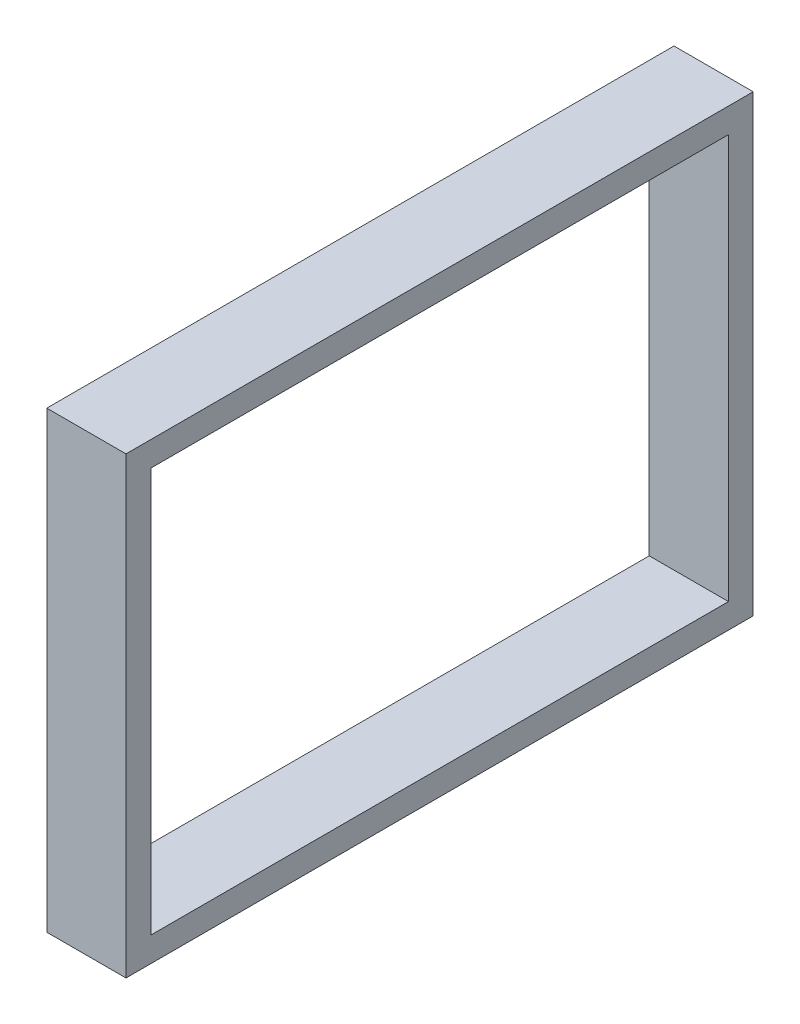
ISO-10303-21;
HEADER;
FILE_DESCRIPTION(('STEP AP214'),'2;1');
FILE_NAME('part.step','',(''),(''),'','','');
FILE_SCHEMA(('AUTOMOTIVE_DESIGN { 1 0 10303 214 1 1 1 1 }'));
ENDSEC;
DATA;
#1=APPLICATION_CONTEXT('core data for automotive mechanical design processes');
#2=APPLICATION_PROTOCOL_DEFINITION('international standard','automotive_design',2000,#1);
#3=PRODUCT_CONTEXT('',#1,'mechanical');
#4=PRODUCT('Part','Part','',(#3));
#5=PRODUCT_RELATED_PRODUCT_CATEGORY('part','',(#4));
#6=PRODUCT_DEFINITION_FORMATION('','',#4);
#7=PRODUCT_DEFINITION_CONTEXT('part definition',#1,'design');
#8=PRODUCT_DEFINITION('design','',#6,#7);
#9=PRODUCT_DEFINITION_SHAPE('','',#8);
#10=(LENGTH_UNIT() NAMED_UNIT(*) SI_UNIT(.MILLI.,.METRE.));
#11=(NAMED_UNIT(*) PLANE_ANGLE_UNIT() SI_UNIT($,.RADIAN.));
#12=(NAMED_UNIT(*) SI_UNIT($,.STERADIAN.) SOLID_ANGLE_UNIT());
#13=UNCERTAINTY_MEASURE_WITH_UNIT(LENGTH_MEASURE(1.E-05),#10,'distance_accuracy_value','');
#14=(GEOMETRIC_REPRESENTATION_CONTEXT(3) GLOBAL_UNCERTAINTY_ASSIGNED_CONTEXT((#13)) GLOBAL_UNIT_ASSIGNED_CONTEXT((#10,
#11,#12)) REPRESENTATION_CONTEXT('',''));
#15=CARTESIAN_POINT('',(0.,0.,0.));
#16=DIRECTION('',(0.,0.,1.));
#17=DIRECTION('',(1.,0.,0.));
#18=AXIS2_PLACEMENT_3D('',#15,#16,#17);
#19=CARTESIAN_POINT('',(2.4,0.,0.));
#20=DIRECTION('',(-1.,0.,0.));
#21=DIRECTION('',(0.,0.,1.));
#22=AXIS2_PLACEMENT_3D('',#19,#20,#21);
#23=PLANE('',#22);
#24=DIRECTION('',(0.,1.,0.));
#25=VECTOR('',#24,1.);
#26=CARTESIAN_POINT('',(2.4,13.75,-6.5));
#27=LINE('',#26,#25);
#28=CARTESIAN_POINT('',(2.4,-13.75,-6.5));
#29=VERTEX_POINT('',#28);
#30=CARTESIAN_POINT('',(2.4,13.75,-6.5));
#31=VERTEX_POINT('',#30);
#32=EDGE_CURVE('E140',#29,#31,#27,.T.);
#33=ORIENTED_EDGE('',*,*,#32,.T.);
#34=DIRECTION('',(0.,0.,1.));
#35=VECTOR('',#34,1.);
#36=CARTESIAN_POINT('',(2.4,13.75,31.5));
#37=LINE('',#36,#35);
#38=CARTESIAN_POINT('',(2.4,13.75,31.5));
#39=VERTEX_POINT('',#38);
#40=EDGE_CURVE('E143',#31,#39,#37,.T.);
#41=ORIENTED_EDGE('',*,*,#40,.T.);
#42=DIRECTION('',(0.,-1.,0.));
#43=VECTOR('',#42,1.);
#44=CARTESIAN_POINT('',(2.4,-13.75,31.5));
#45=LINE('',#44,#43);
#46=CARTESIAN_POINT('',(2.4,-13.75,31.5));
#47=VERTEX_POINT('',#46);
#48=EDGE_CURVE('E146',#39,#47,#45,.T.);
#49=ORIENTED_EDGE('',*,*,#48,.T.);
#50=DIRECTION('',(0.,0.,-1.));
#51=VECTOR('',#50,1.);
#52=CARTESIAN_POINT('',(2.4,-13.75,-6.5));
#53=LINE('',#52,#51);
#54=EDGE_CURVE('E148',#47,#29,#53,.T.);
#55=ORIENTED_EDGE('',*,*,#54,.T.);
#56=EDGE_LOOP('',(#33,#41,#49,#55));
#57=FACE_BOUND('',#56,.T.);
#58=DIRECTION('',(0.,1.,0.));
#59=VECTOR('',#58,1.);
#60=CARTESIAN_POINT('',(2.4,12.25,-5.));
#61=LINE('',#60,#59);
#62=CARTESIAN_POINT('',(2.4,-12.25,-5.));
#63=VERTEX_POINT('',#62);
#64=CARTESIAN_POINT('',(2.4,12.25,-5.));
#65=VERTEX_POINT('',#64);
#66=EDGE_CURVE('E104',#63,#65,#61,.T.);
#67=ORIENTED_EDGE('',*,*,#66,.F.);
#68=DIRECTION('',(0.,0.,-1.));
#69=VECTOR('',#68,1.);
#70=CARTESIAN_POINT('',(2.4,-12.25,-5.));
#71=LINE('',#70,#69);
#72=CARTESIAN_POINT('',(2.4,-12.25,30.));
#73=VERTEX_POINT('',#72);
#74=EDGE_CURVE('E126',#73,#63,#71,.T.);
#75=ORIENTED_EDGE('',*,*,#74,.F.);
#76=DIRECTION('',(0.,-1.,0.));
#77=VECTOR('',#76,1.);
#78=CARTESIAN_POINT('',(2.4,-12.25,30.));
#79=LINE('',#78,#77);
#80=CARTESIAN_POINT('',(2.4,12.25,30.));
#81=VERTEX_POINT('',#80);
#82=EDGE_CURVE('E124',#81,#73,#79,.T.);
#83=ORIENTED_EDGE('',*,*,#82,.F.);
#84=DIRECTION('',(0.,0.,1.));
#85=VECTOR('',#84,1.);
#86=CARTESIAN_POINT('',(2.4,12.25,30.));
#87=LINE('',#86,#85);
#88=EDGE_CURVE('E112',#65,#81,#87,.T.);
#89=ORIENTED_EDGE('',*,*,#88,.F.);
#90=EDGE_LOOP('',(#67,#75,#83,#89));
#91=FACE_BOUND('',#90,.T.);
#92=ADVANCED_FACE('F39',(#57,#91),#23,.F.);
#93=CARTESIAN_POINT('',(-2.4,0.,0.));
#94=DIRECTION('',(-1.,0.,0.));
#95=DIRECTION('',(0.,0.,1.));
#96=AXIS2_PLACEMENT_3D('',#93,#94,#95);
#97=PLANE('',#96);
#98=DIRECTION('',(0.,1.,0.));
#99=VECTOR('',#98,1.);
#100=CARTESIAN_POINT('',(-2.4,13.75,-6.5));
#101=LINE('',#100,#99);
#102=CARTESIAN_POINT('',(-2.4,-13.75,-6.5));
#103=VERTEX_POINT('',#102);
#104=CARTESIAN_POINT('',(-2.4,13.75,-6.5));
#105=VERTEX_POINT('',#104);
#106=EDGE_CURVE('E120',#103,#105,#101,.T.);
#107=ORIENTED_EDGE('',*,*,#106,.F.);
#108=DIRECTION('',(0.,0.,-1.));
#109=VECTOR('',#108,1.);
#110=CARTESIAN_POINT('',(-2.4,-13.75,-6.5));
#111=LINE('',#110,#109);
#112=CARTESIAN_POINT('',(-2.4,-13.75,31.5));
#113=VERTEX_POINT('',#112);
#114=EDGE_CURVE('E144',#113,#103,#111,.T.);
#115=ORIENTED_EDGE('',*,*,#114,.F.);
#116=DIRECTION('',(0.,-1.,0.));
#117=VECTOR('',#116,1.);
#118=CARTESIAN_POINT('',(-2.4,-13.75,31.5));
#119=LINE('',#118,#117);
#120=CARTESIAN_POINT('',(-2.4,13.75,31.5));
#121=VERTEX_POINT('',#120);
#122=EDGE_CURVE('E155',#121,#113,#119,.T.);
#123=ORIENTED_EDGE('',*,*,#122,.F.);
#124=DIRECTION('',(0.,0.,1.));
#125=VECTOR('',#124,1.);
#126=CARTESIAN_POINT('',(-2.4,13.75,31.5));
#127=LINE('',#126,#125);
#128=EDGE_CURVE('E153',#105,#121,#127,.T.);
#129=ORIENTED_EDGE('',*,*,#128,.F.);
#130=EDGE_LOOP('',(#107,#115,#123,#129));
#131=FACE_BOUND('',#130,.T.);
#132=DIRECTION('',(0.,0.,-1.));
#133=VECTOR('',#132,1.);
#134=CARTESIAN_POINT('',(-2.4,-12.25,-5.));
#135=LINE('',#134,#133);
#136=CARTESIAN_POINT('',(-2.4,-12.25,30.));
#137=VERTEX_POINT('',#136);
#138=CARTESIAN_POINT('',(-2.4,-12.25,-5.));
#139=VERTEX_POINT('',#138);
#140=EDGE_CURVE('E113',#137,#139,#135,.T.);
#141=ORIENTED_EDGE('',*,*,#140,.T.);
#142=DIRECTION('',(0.,1.,0.));
#143=VECTOR('',#142,1.);
#144=CARTESIAN_POINT('',(-2.4,12.25,-5.));
#145=LINE('',#144,#143);
#146=CARTESIAN_POINT('',(-2.4,12.25,-5.));
#147=VERTEX_POINT('',#146);
#148=EDGE_CURVE('E62',#139,#147,#145,.T.);
#149=ORIENTED_EDGE('',*,*,#148,.T.);
#150=DIRECTION('',(0.,0.,1.));
#151=VECTOR('',#150,1.);
#152=CARTESIAN_POINT('',(-2.4,12.25,30.));
#153=LINE('',#152,#151);
#154=CARTESIAN_POINT('',(-2.4,12.25,30.));
#155=VERTEX_POINT('',#154);
#156=EDGE_CURVE('E119',#147,#155,#153,.T.);
#157=ORIENTED_EDGE('',*,*,#156,.T.);
#158=DIRECTION('',(0.,-1.,0.));
#159=VECTOR('',#158,1.);
#160=CARTESIAN_POINT('',(-2.4,-12.25,30.));
#161=LINE('',#160,#159);
#162=EDGE_CURVE('E132',#155,#137,#161,.T.);
#163=ORIENTED_EDGE('',*,*,#162,.T.);
#164=EDGE_LOOP('',(#141,#149,#157,#163));
#165=FACE_BOUND('',#164,.T.);
#166=ADVANCED_FACE('F173',(#131,#165),#97,.T.);
#167=CARTESIAN_POINT('',(2.4,13.75,-6.5));
#168=DIRECTION('',(0.,0.,1.));
#169=DIRECTION('',(1.,0.,0.));
#170=AXIS2_PLACEMENT_3D('',#167,#168,#169);
#171=PLANE('',#170);
#172=ORIENTED_EDGE('',*,*,#106,.T.);
#173=DIRECTION('',(-1.,0.,0.));
#174=VECTOR('',#173,1.);
#175=CARTESIAN_POINT('',(2.4,13.75,-6.5));
#176=LINE('',#175,#174);
#177=EDGE_CURVE('E11',#31,#105,#176,.T.);
#178=ORIENTED_EDGE('',*,*,#177,.F.);
#179=ORIENTED_EDGE('',*,*,#32,.F.);
#180=DIRECTION('',(-1.,0.,0.));
#181=VECTOR('',#180,1.);
#182=CARTESIAN_POINT('',(2.4,-13.75,-6.5));
#183=LINE('',#182,#181);
#184=EDGE_CURVE('E150',#29,#103,#183,.T.);
#185=ORIENTED_EDGE('',*,*,#184,.T.);
#186=EDGE_LOOP('',(#172,#178,#179,#185));
#187=FACE_BOUND('',#186,.T.);
#188=ADVANCED_FACE('F41',(#187),#171,.F.);
#189=CARTESIAN_POINT('',(2.4,13.75,31.5));
#190=DIRECTION('',(0.,-1.,0.));
#191=DIRECTION('',(0.,0.,-1.));
#192=AXIS2_PLACEMENT_3D('',#189,#190,#191);
#193=PLANE('',#192);
#194=ORIENTED_EDGE('',*,*,#128,.T.);
#195=DIRECTION('',(-1.,0.,0.));
#196=VECTOR('',#195,1.);
#197=CARTESIAN_POINT('',(2.4,13.75,31.5));
#198=LINE('',#197,#196);
#199=EDGE_CURVE('E47',#39,#121,#198,.T.);
#200=ORIENTED_EDGE('',*,*,#199,.F.);
#201=ORIENTED_EDGE('',*,*,#40,.F.);
#202=ORIENTED_EDGE('',*,*,#177,.T.);
#203=EDGE_LOOP('',(#194,#200,#201,#202));
#204=FACE_BOUND('',#203,.T.);
#205=ADVANCED_FACE('F183',(#204),#193,.F.);
#206=CARTESIAN_POINT('',(2.4,-13.75,31.5));
#207=DIRECTION('',(0.,0.,-1.));
#208=DIRECTION('',(-1.,0.,0.));
#209=AXIS2_PLACEMENT_3D('',#206,#207,#208);
#210=PLANE('',#209);
#211=ORIENTED_EDGE('',*,*,#122,.T.);
#212=DIRECTION('',(-1.,0.,0.));
#213=VECTOR('',#212,1.);
#214=CARTESIAN_POINT('',(2.4,-13.75,31.5));
#215=LINE('',#214,#213);
#216=EDGE_CURVE('E160',#47,#113,#215,.T.);
#217=ORIENTED_EDGE('',*,*,#216,.F.);
#218=ORIENTED_EDGE('',*,*,#48,.F.);
#219=ORIENTED_EDGE('',*,*,#199,.T.);
#220=EDGE_LOOP('',(#211,#217,#218,#219));
#221=FACE_BOUND('',#220,.T.);
#222=ADVANCED_FACE('F167',(#221),#210,.F.);
#223=CARTESIAN_POINT('',(2.4,-13.75,-6.5));
#224=DIRECTION('',(0.,1.,0.));
#225=DIRECTION('',(0.,0.,1.));
#226=AXIS2_PLACEMENT_3D('',#223,#224,#225);
#227=PLANE('',#226);
#228=ORIENTED_EDGE('',*,*,#114,.T.);
#229=ORIENTED_EDGE('',*,*,#184,.F.);
#230=ORIENTED_EDGE('',*,*,#54,.F.);
#231=ORIENTED_EDGE('',*,*,#216,.T.);
#232=EDGE_LOOP('',(#228,#229,#230,#231));
#233=FACE_BOUND('',#232,.T.);
#234=ADVANCED_FACE('F177',(#233),#227,.F.);
#235=CARTESIAN_POINT('',(2.4,12.25,-5.));
#236=DIRECTION('',(0.,0.,1.));
#237=DIRECTION('',(1.,0.,0.));
#238=AXIS2_PLACEMENT_3D('',#235,#236,#237);
#239=PLANE('',#238);
#240=ORIENTED_EDGE('',*,*,#148,.F.);
#241=DIRECTION('',(-1.,0.,0.));
#242=VECTOR('',#241,1.);
#243=CARTESIAN_POINT('',(2.4,-12.25,-5.));
#244=LINE('',#243,#242);
#245=EDGE_CURVE('E108',#63,#139,#244,.T.);
#246=ORIENTED_EDGE('',*,*,#245,.F.);
#247=ORIENTED_EDGE('',*,*,#66,.T.);
#248=DIRECTION('',(-1.,0.,0.));
#249=VECTOR('',#248,1.);
#250=CARTESIAN_POINT('',(2.4,12.25,-5.));
#251=LINE('',#250,#249);
#252=EDGE_CURVE('E107',#65,#147,#251,.T.);
#253=ORIENTED_EDGE('',*,*,#252,.T.);
#254=EDGE_LOOP('',(#240,#246,#247,#253));
#255=FACE_BOUND('',#254,.T.);
#256=ADVANCED_FACE('F106',(#255),#239,.T.);
#257=CARTESIAN_POINT('',(2.4,12.25,30.));
#258=DIRECTION('',(0.,-1.,0.));
#259=DIRECTION('',(0.,0.,-1.));
#260=AXIS2_PLACEMENT_3D('',#257,#258,#259);
#261=PLANE('',#260);
#262=ORIENTED_EDGE('',*,*,#156,.F.);
#263=ORIENTED_EDGE('',*,*,#252,.F.);
#264=ORIENTED_EDGE('',*,*,#88,.T.);
#265=DIRECTION('',(-1.,0.,0.));
#266=VECTOR('',#265,1.);
#267=CARTESIAN_POINT('',(2.4,12.25,30.));
#268=LINE('',#267,#266);
#269=EDGE_CURVE('E121',#81,#155,#268,.T.);
#270=ORIENTED_EDGE('',*,*,#269,.T.);
#271=EDGE_LOOP('',(#262,#263,#264,#270));
#272=FACE_BOUND('',#271,.T.);
#273=ADVANCED_FACE('F116',(#272),#261,.T.);
#274=CARTESIAN_POINT('',(2.4,-12.25,30.));
#275=DIRECTION('',(0.,0.,-1.));
#276=DIRECTION('',(-1.,0.,0.));
#277=AXIS2_PLACEMENT_3D('',#274,#275,#276);
#278=PLANE('',#277);
#279=ORIENTED_EDGE('',*,*,#162,.F.);
#280=ORIENTED_EDGE('',*,*,#269,.F.);
#281=ORIENTED_EDGE('',*,*,#82,.T.);
#282=DIRECTION('',(-1.,0.,0.));
#283=VECTOR('',#282,1.);
#284=CARTESIAN_POINT('',(2.4,-12.25,30.));
#285=LINE('',#284,#283);
#286=EDGE_CURVE('E54',#73,#137,#285,.T.);
#287=ORIENTED_EDGE('',*,*,#286,.T.);
#288=EDGE_LOOP('',(#279,#280,#281,#287));
#289=FACE_BOUND('',#288,.T.);
#290=ADVANCED_FACE('F206',(#289),#278,.T.);
#291=CARTESIAN_POINT('',(2.4,-12.25,-5.));
#292=DIRECTION('',(0.,1.,0.));
#293=DIRECTION('',(0.,0.,1.));
#294=AXIS2_PLACEMENT_3D('',#291,#292,#293);
#295=PLANE('',#294);
#296=ORIENTED_EDGE('',*,*,#140,.F.);
#297=ORIENTED_EDGE('',*,*,#286,.F.);
#298=ORIENTED_EDGE('',*,*,#74,.T.);
#299=ORIENTED_EDGE('',*,*,#245,.T.);
#300=EDGE_LOOP('',(#296,#297,#298,#299));
#301=FACE_BOUND('',#300,.T.);
#302=ADVANCED_FACE('F210',(#301),#295,.T.);
#303=CLOSED_SHELL('',(#92,#166,#188,#205,#222,#234,#256,#273,#290,#302));
#304=MANIFOLD_SOLID_BREP('B2',#303);
#305=ADVANCED_BREP_SHAPE_REPRESENTATION('',(#18,#304),#14);
#306=SHAPE_DEFINITION_REPRESENTATION(#9,#305);
ENDSEC;
END-ISO-10303-21;
